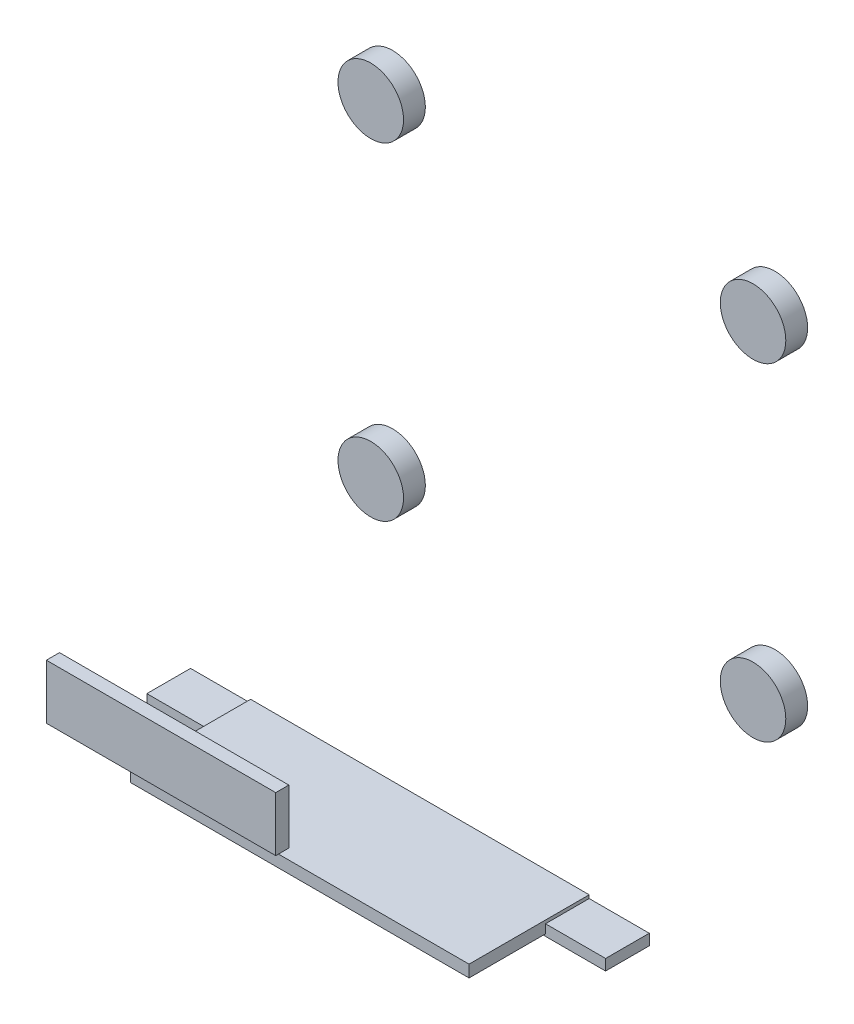
ISO-10303-21;
HEADER;
FILE_DESCRIPTION(('STEP AP214'),'2;1');
FILE_NAME('part.step','',(''),(''),'','','');
FILE_SCHEMA(('AUTOMOTIVE_DESIGN { 1 0 10303 214 1 1 1 1 }'));
ENDSEC;
DATA;
#1=APPLICATION_CONTEXT('core data for automotive mechanical design processes');
#2=APPLICATION_PROTOCOL_DEFINITION('international standard','automotive_design',2000,#1);
#3=PRODUCT_CONTEXT('',#1,'mechanical');
#4=PRODUCT('Part','Part','',(#3));
#5=PRODUCT_RELATED_PRODUCT_CATEGORY('part','',(#4));
#6=PRODUCT_DEFINITION_FORMATION('','',#4);
#7=PRODUCT_DEFINITION_CONTEXT('part definition',#1,'design');
#8=PRODUCT_DEFINITION('design','',#6,#7);
#9=PRODUCT_DEFINITION_SHAPE('','',#8);
#10=(LENGTH_UNIT() NAMED_UNIT(*) SI_UNIT(.MILLI.,.METRE.));
#11=(NAMED_UNIT(*) PLANE_ANGLE_UNIT() SI_UNIT($,.RADIAN.));
#12=(NAMED_UNIT(*) SI_UNIT($,.STERADIAN.) SOLID_ANGLE_UNIT());
#13=UNCERTAINTY_MEASURE_WITH_UNIT(LENGTH_MEASURE(1.E-05),#10,'distance_accuracy_value','');
#14=(GEOMETRIC_REPRESENTATION_CONTEXT(3) GLOBAL_UNCERTAINTY_ASSIGNED_CONTEXT((#13)) GLOBAL_UNIT_ASSIGNED_CONTEXT((#10,
#11,#12)) REPRESENTATION_CONTEXT('',''));
#15=CARTESIAN_POINT('',(0.,0.,0.));
#16=DIRECTION('',(0.,0.,1.));
#17=DIRECTION('',(1.,0.,0.));
#18=AXIS2_PLACEMENT_3D('',#15,#16,#17);
#19=CARTESIAN_POINT('',(35.,30.,0.));
#20=DIRECTION('',(0.,0.,-1.));
#21=DIRECTION('',(-1.,0.,0.));
#22=AXIS2_PLACEMENT_3D('',#19,#20,#21);
#23=CYLINDRICAL_SURFACE('',#22,6.);
#24=CARTESIAN_POINT('',(35.,30.,0.));
#25=DIRECTION('',(0.,0.,1.));
#26=DIRECTION('',(1.,0.,0.));
#27=AXIS2_PLACEMENT_3D('',#24,#25,#26);
#28=CIRCLE('',#27,6.);
#29=CARTESIAN_POINT('',(41.,30.,0.));
#30=VERTEX_POINT('',#29);
#31=EDGE_CURVE('E11',#30,#30,#28,.T.);
#32=ORIENTED_EDGE('',*,*,#31,.F.);
#33=EDGE_LOOP('',(#32));
#34=FACE_BOUND('',#33,.T.);
#35=CARTESIAN_POINT('',(35.,30.,-4.));
#36=DIRECTION('',(0.,0.,1.));
#37=DIRECTION('',(1.,0.,0.));
#38=AXIS2_PLACEMENT_3D('',#35,#36,#37);
#39=CIRCLE('',#38,6.);
#40=CARTESIAN_POINT('',(41.,30.,-4.));
#41=VERTEX_POINT('',#40);
#42=EDGE_CURVE('E45',#41,#41,#39,.T.);
#43=ORIENTED_EDGE('',*,*,#42,.T.);
#44=EDGE_LOOP('',(#43));
#45=FACE_BOUND('',#44,.T.);
#46=ADVANCED_FACE('F42',(#34,#45),#23,.T.);
#47=CARTESIAN_POINT('',(35.,30.,0.));
#48=DIRECTION('',(0.,0.,1.));
#49=DIRECTION('',(1.,0.,0.));
#50=AXIS2_PLACEMENT_3D('',#47,#48,#49);
#51=PLANE('',#50);
#52=ORIENTED_EDGE('',*,*,#31,.T.);
#53=EDGE_LOOP('',(#52));
#54=FACE_BOUND('',#53,.T.);
#55=ADVANCED_FACE('F57',(#54),#51,.T.);
#56=CARTESIAN_POINT('',(35.,30.,-4.));
#57=DIRECTION('',(0.,0.,1.));
#58=DIRECTION('',(1.,0.,0.));
#59=AXIS2_PLACEMENT_3D('',#56,#57,#58);
#60=PLANE('',#59);
#61=ORIENTED_EDGE('',*,*,#42,.F.);
#62=EDGE_LOOP('',(#61));
#63=FACE_BOUND('',#62,.T.);
#64=ADVANCED_FACE('F55',(#63),#60,.F.);
#65=CLOSED_SHELL('',(#46,#55,#64));
#66=MANIFOLD_SOLID_BREP('B2',#65);
#67=CARTESIAN_POINT('',(-35.,30.,0.));
#68=DIRECTION('',(0.,0.,-1.));
#69=DIRECTION('',(-1.,0.,0.));
#70=AXIS2_PLACEMENT_3D('',#67,#68,#69);
#71=CYLINDRICAL_SURFACE('',#70,6.);
#72=CARTESIAN_POINT('',(-35.,30.,0.));
#73=DIRECTION('',(0.,0.,1.));
#74=DIRECTION('',(1.,0.,0.));
#75=AXIS2_PLACEMENT_3D('',#72,#73,#74);
#76=CIRCLE('',#75,6.);
#77=CARTESIAN_POINT('',(-29.,30.,0.));
#78=VERTEX_POINT('',#77);
#79=EDGE_CURVE('E41',#78,#78,#76,.T.);
#80=ORIENTED_EDGE('',*,*,#79,.F.);
#81=EDGE_LOOP('',(#80));
#82=FACE_BOUND('',#81,.T.);
#83=CARTESIAN_POINT('',(-35.,30.,-4.));
#84=DIRECTION('',(0.,0.,1.));
#85=DIRECTION('',(1.,0.,0.));
#86=AXIS2_PLACEMENT_3D('',#83,#84,#85);
#87=CIRCLE('',#86,6.);
#88=CARTESIAN_POINT('',(-29.,30.,-4.));
#89=VERTEX_POINT('',#88);
#90=EDGE_CURVE('E94',#89,#89,#87,.T.);
#91=ORIENTED_EDGE('',*,*,#90,.T.);
#92=EDGE_LOOP('',(#91));
#93=FACE_BOUND('',#92,.T.);
#94=ADVANCED_FACE('F91',(#82,#93),#71,.T.);
#95=CARTESIAN_POINT('',(-35.,30.,0.));
#96=DIRECTION('',(0.,0.,1.));
#97=DIRECTION('',(1.,0.,0.));
#98=AXIS2_PLACEMENT_3D('',#95,#96,#97);
#99=PLANE('',#98);
#100=ORIENTED_EDGE('',*,*,#79,.T.);
#101=EDGE_LOOP('',(#100));
#102=FACE_BOUND('',#101,.T.);
#103=ADVANCED_FACE('F106',(#102),#99,.T.);
#104=CARTESIAN_POINT('',(-35.,30.,-4.));
#105=DIRECTION('',(0.,0.,1.));
#106=DIRECTION('',(1.,0.,0.));
#107=AXIS2_PLACEMENT_3D('',#104,#105,#106);
#108=PLANE('',#107);
#109=ORIENTED_EDGE('',*,*,#90,.F.);
#110=EDGE_LOOP('',(#109));
#111=FACE_BOUND('',#110,.T.);
#112=ADVANCED_FACE('F104',(#111),#108,.F.);
#113=CLOSED_SHELL('',(#94,#103,#112));
#114=MANIFOLD_SOLID_BREP('B6',#113);
#115=CARTESIAN_POINT('',(35.,-30.,0.));
#116=DIRECTION('',(0.,0.,-1.));
#117=DIRECTION('',(-1.,0.,0.));
#118=AXIS2_PLACEMENT_3D('',#115,#116,#117);
#119=CYLINDRICAL_SURFACE('',#118,6.);
#120=CARTESIAN_POINT('',(35.,-30.,0.));
#121=DIRECTION('',(0.,0.,1.));
#122=DIRECTION('',(1.,0.,0.));
#123=AXIS2_PLACEMENT_3D('',#120,#121,#122);
#124=CIRCLE('',#123,6.);
#125=CARTESIAN_POINT('',(41.,-30.,0.));
#126=VERTEX_POINT('',#125);
#127=EDGE_CURVE('E90',#126,#126,#124,.T.);
#128=ORIENTED_EDGE('',*,*,#127,.F.);
#129=EDGE_LOOP('',(#128));
#130=FACE_BOUND('',#129,.T.);
#131=CARTESIAN_POINT('',(35.,-30.,-4.));
#132=DIRECTION('',(0.,0.,1.));
#133=DIRECTION('',(1.,0.,0.));
#134=AXIS2_PLACEMENT_3D('',#131,#132,#133);
#135=CIRCLE('',#134,6.);
#136=CARTESIAN_POINT('',(41.,-30.,-4.));
#137=VERTEX_POINT('',#136);
#138=EDGE_CURVE('E143',#137,#137,#135,.T.);
#139=ORIENTED_EDGE('',*,*,#138,.T.);
#140=EDGE_LOOP('',(#139));
#141=FACE_BOUND('',#140,.T.);
#142=ADVANCED_FACE('F140',(#130,#141),#119,.T.);
#143=CARTESIAN_POINT('',(35.,-30.,0.));
#144=DIRECTION('',(0.,0.,1.));
#145=DIRECTION('',(1.,0.,0.));
#146=AXIS2_PLACEMENT_3D('',#143,#144,#145);
#147=PLANE('',#146);
#148=ORIENTED_EDGE('',*,*,#127,.T.);
#149=EDGE_LOOP('',(#148));
#150=FACE_BOUND('',#149,.T.);
#151=ADVANCED_FACE('F155',(#150),#147,.T.);
#152=CARTESIAN_POINT('',(35.,-30.,-4.));
#153=DIRECTION('',(0.,0.,1.));
#154=DIRECTION('',(1.,0.,0.));
#155=AXIS2_PLACEMENT_3D('',#152,#153,#154);
#156=PLANE('',#155);
#157=ORIENTED_EDGE('',*,*,#138,.F.);
#158=EDGE_LOOP('',(#157));
#159=FACE_BOUND('',#158,.T.);
#160=ADVANCED_FACE('F153',(#159),#156,.F.);
#161=CLOSED_SHELL('',(#142,#151,#160));
#162=MANIFOLD_SOLID_BREP('B36',#161);
#163=CARTESIAN_POINT('',(-35.,-30.,0.));
#164=DIRECTION('',(0.,0.,-1.));
#165=DIRECTION('',(-1.,0.,0.));
#166=AXIS2_PLACEMENT_3D('',#163,#164,#165);
#167=CYLINDRICAL_SURFACE('',#166,6.);
#168=CARTESIAN_POINT('',(-35.,-30.,0.));
#169=DIRECTION('',(0.,0.,1.));
#170=DIRECTION('',(1.,0.,0.));
#171=AXIS2_PLACEMENT_3D('',#168,#169,#170);
#172=CIRCLE('',#171,6.);
#173=CARTESIAN_POINT('',(-29.,-30.,0.));
#174=VERTEX_POINT('',#173);
#175=EDGE_CURVE('E139',#174,#174,#172,.T.);
#176=ORIENTED_EDGE('',*,*,#175,.F.);
#177=EDGE_LOOP('',(#176));
#178=FACE_BOUND('',#177,.T.);
#179=CARTESIAN_POINT('',(-35.,-30.,-4.));
#180=DIRECTION('',(0.,0.,1.));
#181=DIRECTION('',(1.,0.,0.));
#182=AXIS2_PLACEMENT_3D('',#179,#180,#181);
#183=CIRCLE('',#182,6.);
#184=CARTESIAN_POINT('',(-29.,-30.,-4.));
#185=VERTEX_POINT('',#184);
#186=EDGE_CURVE('E194',#185,#185,#183,.T.);
#187=ORIENTED_EDGE('',*,*,#186,.T.);
#188=EDGE_LOOP('',(#187));
#189=FACE_BOUND('',#188,.T.);
#190=ADVANCED_FACE('F191',(#178,#189),#167,.T.);
#191=CARTESIAN_POINT('',(-35.,-30.,0.));
#192=DIRECTION('',(0.,0.,1.));
#193=DIRECTION('',(1.,0.,0.));
#194=AXIS2_PLACEMENT_3D('',#191,#192,#193);
#195=PLANE('',#194);
#196=ORIENTED_EDGE('',*,*,#175,.T.);
#197=EDGE_LOOP('',(#196));
#198=FACE_BOUND('',#197,.T.);
#199=ADVANCED_FACE('F206',(#198),#195,.T.);
#200=CARTESIAN_POINT('',(-35.,-30.,-4.));
#201=DIRECTION('',(0.,0.,1.));
#202=DIRECTION('',(1.,0.,0.));
#203=AXIS2_PLACEMENT_3D('',#200,#201,#202);
#204=PLANE('',#203);
#205=ORIENTED_EDGE('',*,*,#186,.F.);
#206=EDGE_LOOP('',(#205));
#207=FACE_BOUND('',#206,.T.);
#208=ADVANCED_FACE('F204',(#207),#204,.F.);
#209=CLOSED_SHELL('',(#190,#199,#208));
#210=MANIFOLD_SOLID_BREP('B85',#209);
#211=CARTESIAN_POINT('',(42.,-52.5,34.));
#212=DIRECTION('',(-1.,0.,0.));
#213=DIRECTION('',(0.,0.,1.));
#214=AXIS2_PLACEMENT_3D('',#211,#212,#213);
#215=PLANE('',#214);
#216=DIRECTION('',(0.,1.,0.));
#217=VECTOR('',#216,1.);
#218=CARTESIAN_POINT('',(42.,-52.5,26.));
#219=LINE('',#218,#217);
#220=CARTESIAN_POINT('',(42.,-52.5,26.));
#221=VERTEX_POINT('',#220);
#222=CARTESIAN_POINT('',(42.,-50.5,26.));
#223=VERTEX_POINT('',#222);
#224=EDGE_CURVE('E305',#221,#223,#219,.T.);
#225=ORIENTED_EDGE('',*,*,#224,.T.);
#226=DIRECTION('',(0.,0.,-1.));
#227=VECTOR('',#226,1.);
#228=CARTESIAN_POINT('',(42.,-50.5,34.));
#229=LINE('',#228,#227);
#230=CARTESIAN_POINT('',(42.,-50.5,34.));
#231=VERTEX_POINT('',#230);
#232=EDGE_CURVE('E189',#231,#223,#229,.T.);
#233=ORIENTED_EDGE('',*,*,#232,.F.);
#234=DIRECTION('',(0.,1.,0.));
#235=VECTOR('',#234,1.);
#236=CARTESIAN_POINT('',(42.,-52.5,34.));
#237=LINE('',#236,#235);
#238=CARTESIAN_POINT('',(42.,-52.5,34.));
#239=VERTEX_POINT('',#238);
#240=EDGE_CURVE('E293',#239,#231,#237,.T.);
#241=ORIENTED_EDGE('',*,*,#240,.F.);
#242=DIRECTION('',(0.,0.,-1.));
#243=VECTOR('',#242,1.);
#244=CARTESIAN_POINT('',(42.,-52.5,34.));
#245=LINE('',#244,#243);
#246=EDGE_CURVE('E301',#239,#221,#245,.T.);
#247=ORIENTED_EDGE('',*,*,#246,.T.);
#248=EDGE_LOOP('',(#225,#233,#241,#247));
#249=FACE_BOUND('',#248,.T.);
#250=ADVANCED_FACE('F242',(#249),#215,.F.);
#251=CARTESIAN_POINT('',(30.,-50.5,34.));
#252=DIRECTION('',(0.,-1.,0.));
#253=DIRECTION('',(0.,0.,-1.));
#254=AXIS2_PLACEMENT_3D('',#251,#252,#253);
#255=PLANE('',#254);
#256=DIRECTION('',(-1.,0.,0.));
#257=VECTOR('',#256,1.);
#258=CARTESIAN_POINT('',(30.,-50.5,26.));
#259=LINE('',#258,#257);
#260=CARTESIAN_POINT('',(30.,-50.5,26.));
#261=VERTEX_POINT('',#260);
#262=EDGE_CURVE('E297',#223,#261,#259,.T.);
#263=ORIENTED_EDGE('',*,*,#262,.T.);
#264=DIRECTION('',(0.,0.,-1.));
#265=VECTOR('',#264,1.);
#266=CARTESIAN_POINT('',(30.,-50.5,34.));
#267=LINE('',#266,#265);
#268=CARTESIAN_POINT('',(30.,-50.5,34.));
#269=VERTEX_POINT('',#268);
#270=EDGE_CURVE('E250',#269,#261,#267,.T.);
#271=ORIENTED_EDGE('',*,*,#270,.F.);
#272=DIRECTION('',(-1.,0.,0.));
#273=VECTOR('',#272,1.);
#274=CARTESIAN_POINT('',(30.,-50.5,34.));
#275=LINE('',#274,#273);
#276=EDGE_CURVE('E288',#231,#269,#275,.T.);
#277=ORIENTED_EDGE('',*,*,#276,.F.);
#278=ORIENTED_EDGE('',*,*,#232,.T.);
#279=EDGE_LOOP('',(#263,#271,#277,#278));
#280=FACE_BOUND('',#279,.T.);
#281=ADVANCED_FACE('F296',(#280),#255,.F.);
#282=CARTESIAN_POINT('',(30.,-52.5,34.));
#283=DIRECTION('',(1.,0.,0.));
#284=DIRECTION('',(0.,0.,-1.));
#285=AXIS2_PLACEMENT_3D('',#282,#283,#284);
#286=PLANE('',#285);
#287=DIRECTION('',(0.,-1.,0.));
#288=VECTOR('',#287,1.);
#289=CARTESIAN_POINT('',(30.,-52.5,26.));
#290=LINE('',#289,#288);
#291=CARTESIAN_POINT('',(30.,-52.5,26.));
#292=VERTEX_POINT('',#291);
#293=EDGE_CURVE('E275',#261,#292,#290,.T.);
#294=ORIENTED_EDGE('',*,*,#293,.T.);
#295=DIRECTION('',(0.,0.,-1.));
#296=VECTOR('',#295,1.);
#297=CARTESIAN_POINT('',(30.,-52.5,34.));
#298=LINE('',#297,#296);
#299=CARTESIAN_POINT('',(30.,-52.5,34.));
#300=VERTEX_POINT('',#299);
#301=EDGE_CURVE('E298',#300,#292,#298,.T.);
#302=ORIENTED_EDGE('',*,*,#301,.F.);
#303=DIRECTION('',(0.,-1.,0.));
#304=VECTOR('',#303,1.);
#305=CARTESIAN_POINT('',(30.,-52.5,34.));
#306=LINE('',#305,#304);
#307=EDGE_CURVE('E291',#269,#300,#306,.T.);
#308=ORIENTED_EDGE('',*,*,#307,.F.);
#309=ORIENTED_EDGE('',*,*,#270,.T.);
#310=EDGE_LOOP('',(#294,#302,#308,#309));
#311=FACE_BOUND('',#310,.T.);
#312=ADVANCED_FACE('F299',(#311),#286,.F.);
#313=CARTESIAN_POINT('',(30.,-52.5,34.));
#314=DIRECTION('',(0.,1.,0.));
#315=DIRECTION('',(0.,0.,1.));
#316=AXIS2_PLACEMENT_3D('',#313,#314,#315);
#317=PLANE('',#316);
#318=DIRECTION('',(1.,0.,0.));
#319=VECTOR('',#318,1.);
#320=CARTESIAN_POINT('',(30.,-52.5,26.));
#321=LINE('',#320,#319);
#322=EDGE_CURVE('E281',#292,#221,#321,.T.);
#323=ORIENTED_EDGE('',*,*,#322,.T.);
#324=ORIENTED_EDGE('',*,*,#246,.F.);
#325=DIRECTION('',(1.,0.,0.));
#326=VECTOR('',#325,1.);
#327=CARTESIAN_POINT('',(30.,-52.5,34.));
#328=LINE('',#327,#326);
#329=EDGE_CURVE('E258',#300,#239,#328,.T.);
#330=ORIENTED_EDGE('',*,*,#329,.F.);
#331=ORIENTED_EDGE('',*,*,#301,.T.);
#332=EDGE_LOOP('',(#323,#324,#330,#331));
#333=FACE_BOUND('',#332,.T.);
#334=ADVANCED_FACE('F312',(#333),#317,.F.);
#335=CARTESIAN_POINT('',(0.,0.,34.));
#336=DIRECTION('',(0.,0.,-1.));
#337=DIRECTION('',(-1.,0.,0.));
#338=AXIS2_PLACEMENT_3D('',#335,#336,#337);
#339=PLANE('',#338);
#340=ORIENTED_EDGE('',*,*,#240,.T.);
#341=ORIENTED_EDGE('',*,*,#276,.T.);
#342=ORIENTED_EDGE('',*,*,#307,.T.);
#343=ORIENTED_EDGE('',*,*,#329,.T.);
#344=EDGE_LOOP('',(#340,#341,#342,#343));
#345=FACE_BOUND('',#344,.T.);
#346=ADVANCED_FACE('F289',(#345),#339,.F.);
#347=CARTESIAN_POINT('',(0.,0.,26.));
#348=DIRECTION('',(0.,0.,-1.));
#349=DIRECTION('',(-1.,0.,0.));
#350=AXIS2_PLACEMENT_3D('',#347,#348,#349);
#351=PLANE('',#350);
#352=ORIENTED_EDGE('',*,*,#224,.F.);
#353=ORIENTED_EDGE('',*,*,#322,.F.);
#354=ORIENTED_EDGE('',*,*,#293,.F.);
#355=ORIENTED_EDGE('',*,*,#262,.F.);
#356=EDGE_LOOP('',(#352,#353,#354,#355));
#357=FACE_BOUND('',#356,.T.);
#358=ADVANCED_FACE('F315',(#357),#351,.T.);
#359=CLOSED_SHELL('',(#250,#281,#312,#334,#346,#358));
#360=MANIFOLD_SOLID_BREP('B134',#359);
#361=CARTESIAN_POINT('',(-30.,-52.5,34.));
#362=DIRECTION('',(-1.,0.,0.));
#363=DIRECTION('',(0.,0.,1.));
#364=AXIS2_PLACEMENT_3D('',#361,#362,#363);
#365=PLANE('',#364);
#366=DIRECTION('',(0.,1.,0.));
#367=VECTOR('',#366,1.);
#368=CARTESIAN_POINT('',(-30.,-52.5,26.));
#369=LINE('',#368,#367);
#370=CARTESIAN_POINT('',(-30.,-52.5,26.));
#371=VERTEX_POINT('',#370);
#372=CARTESIAN_POINT('',(-30.,-50.5,26.));
#373=VERTEX_POINT('',#372);
#374=EDGE_CURVE('E439',#371,#373,#369,.T.);
#375=ORIENTED_EDGE('',*,*,#374,.T.);
#376=DIRECTION('',(0.,0.,-1.));
#377=VECTOR('',#376,1.);
#378=CARTESIAN_POINT('',(-30.,-50.5,34.));
#379=LINE('',#378,#377);
#380=CARTESIAN_POINT('',(-30.,-50.5,34.));
#381=VERTEX_POINT('',#380);
#382=EDGE_CURVE('E240',#381,#373,#379,.T.);
#383=ORIENTED_EDGE('',*,*,#382,.F.);
#384=DIRECTION('',(0.,1.,0.));
#385=VECTOR('',#384,1.);
#386=CARTESIAN_POINT('',(-30.,-52.5,34.));
#387=LINE('',#386,#385);
#388=CARTESIAN_POINT('',(-30.,-52.5,34.));
#389=VERTEX_POINT('',#388);
#390=EDGE_CURVE('E427',#389,#381,#387,.T.);
#391=ORIENTED_EDGE('',*,*,#390,.F.);
#392=DIRECTION('',(0.,0.,-1.));
#393=VECTOR('',#392,1.);
#394=CARTESIAN_POINT('',(-30.,-52.5,34.));
#395=LINE('',#394,#393);
#396=EDGE_CURVE('E435',#389,#371,#395,.T.);
#397=ORIENTED_EDGE('',*,*,#396,.T.);
#398=EDGE_LOOP('',(#375,#383,#391,#397));
#399=FACE_BOUND('',#398,.T.);
#400=ADVANCED_FACE('F376',(#399),#365,.F.);
#401=CARTESIAN_POINT('',(-42.,-50.5,34.));
#402=DIRECTION('',(0.,-1.,0.));
#403=DIRECTION('',(0.,0.,-1.));
#404=AXIS2_PLACEMENT_3D('',#401,#402,#403);
#405=PLANE('',#404);
#406=DIRECTION('',(-1.,0.,0.));
#407=VECTOR('',#406,1.);
#408=CARTESIAN_POINT('',(-42.,-50.5,26.));
#409=LINE('',#408,#407);
#410=CARTESIAN_POINT('',(-42.,-50.5,26.));
#411=VERTEX_POINT('',#410);
#412=EDGE_CURVE('E431',#373,#411,#409,.T.);
#413=ORIENTED_EDGE('',*,*,#412,.T.);
#414=DIRECTION('',(0.,0.,-1.));
#415=VECTOR('',#414,1.);
#416=CARTESIAN_POINT('',(-42.,-50.5,34.));
#417=LINE('',#416,#415);
#418=CARTESIAN_POINT('',(-42.,-50.5,34.));
#419=VERTEX_POINT('',#418);
#420=EDGE_CURVE('E384',#419,#411,#417,.T.);
#421=ORIENTED_EDGE('',*,*,#420,.F.);
#422=DIRECTION('',(-1.,0.,0.));
#423=VECTOR('',#422,1.);
#424=CARTESIAN_POINT('',(-42.,-50.5,34.));
#425=LINE('',#424,#423);
#426=EDGE_CURVE('E422',#381,#419,#425,.T.);
#427=ORIENTED_EDGE('',*,*,#426,.F.);
#428=ORIENTED_EDGE('',*,*,#382,.T.);
#429=EDGE_LOOP('',(#413,#421,#427,#428));
#430=FACE_BOUND('',#429,.T.);
#431=ADVANCED_FACE('F430',(#430),#405,.F.);
#432=CARTESIAN_POINT('',(-42.,-52.5,34.));
#433=DIRECTION('',(1.,0.,0.));
#434=DIRECTION('',(0.,0.,-1.));
#435=AXIS2_PLACEMENT_3D('',#432,#433,#434);
#436=PLANE('',#435);
#437=DIRECTION('',(0.,-1.,0.));
#438=VECTOR('',#437,1.);
#439=CARTESIAN_POINT('',(-42.,-52.5,26.));
#440=LINE('',#439,#438);
#441=CARTESIAN_POINT('',(-42.,-52.5,26.));
#442=VERTEX_POINT('',#441);
#443=EDGE_CURVE('E409',#411,#442,#440,.T.);
#444=ORIENTED_EDGE('',*,*,#443,.T.);
#445=DIRECTION('',(0.,0.,-1.));
#446=VECTOR('',#445,1.);
#447=CARTESIAN_POINT('',(-42.,-52.5,34.));
#448=LINE('',#447,#446);
#449=CARTESIAN_POINT('',(-42.,-52.5,34.));
#450=VERTEX_POINT('',#449);
#451=EDGE_CURVE('E432',#450,#442,#448,.T.);
#452=ORIENTED_EDGE('',*,*,#451,.F.);
#453=DIRECTION('',(0.,-1.,0.));
#454=VECTOR('',#453,1.);
#455=CARTESIAN_POINT('',(-42.,-52.5,34.));
#456=LINE('',#455,#454);
#457=EDGE_CURVE('E425',#419,#450,#456,.T.);
#458=ORIENTED_EDGE('',*,*,#457,.F.);
#459=ORIENTED_EDGE('',*,*,#420,.T.);
#460=EDGE_LOOP('',(#444,#452,#458,#459));
#461=FACE_BOUND('',#460,.T.);
#462=ADVANCED_FACE('F433',(#461),#436,.F.);
#463=CARTESIAN_POINT('',(-42.,-52.5,34.));
#464=DIRECTION('',(0.,1.,0.));
#465=DIRECTION('',(0.,0.,1.));
#466=AXIS2_PLACEMENT_3D('',#463,#464,#465);
#467=PLANE('',#466);
#468=DIRECTION('',(1.,0.,0.));
#469=VECTOR('',#468,1.);
#470=CARTESIAN_POINT('',(-42.,-52.5,26.));
#471=LINE('',#470,#469);
#472=EDGE_CURVE('E415',#442,#371,#471,.T.);
#473=ORIENTED_EDGE('',*,*,#472,.T.);
#474=ORIENTED_EDGE('',*,*,#396,.F.);
#475=DIRECTION('',(1.,0.,0.));
#476=VECTOR('',#475,1.);
#477=CARTESIAN_POINT('',(-42.,-52.5,34.));
#478=LINE('',#477,#476);
#479=EDGE_CURVE('E392',#450,#389,#478,.T.);
#480=ORIENTED_EDGE('',*,*,#479,.F.);
#481=ORIENTED_EDGE('',*,*,#451,.T.);
#482=EDGE_LOOP('',(#473,#474,#480,#481));
#483=FACE_BOUND('',#482,.T.);
#484=ADVANCED_FACE('F446',(#483),#467,.F.);
#485=CARTESIAN_POINT('',(0.,0.,34.));
#486=DIRECTION('',(0.,0.,-1.));
#487=DIRECTION('',(-1.,0.,0.));
#488=AXIS2_PLACEMENT_3D('',#485,#486,#487);
#489=PLANE('',#488);
#490=ORIENTED_EDGE('',*,*,#390,.T.);
#491=ORIENTED_EDGE('',*,*,#426,.T.);
#492=ORIENTED_EDGE('',*,*,#457,.T.);
#493=ORIENTED_EDGE('',*,*,#479,.T.);
#494=EDGE_LOOP('',(#490,#491,#492,#493));
#495=FACE_BOUND('',#494,.T.);
#496=ADVANCED_FACE('F423',(#495),#489,.F.);
#497=CARTESIAN_POINT('',(0.,0.,26.));
#498=DIRECTION('',(0.,0.,-1.));
#499=DIRECTION('',(-1.,0.,0.));
#500=AXIS2_PLACEMENT_3D('',#497,#498,#499);
#501=PLANE('',#500);
#502=ORIENTED_EDGE('',*,*,#374,.F.);
#503=ORIENTED_EDGE('',*,*,#472,.F.);
#504=ORIENTED_EDGE('',*,*,#443,.F.);
#505=ORIENTED_EDGE('',*,*,#412,.F.);
#506=EDGE_LOOP('',(#502,#503,#504,#505));
#507=FACE_BOUND('',#506,.T.);
#508=ADVANCED_FACE('F449',(#507),#501,.T.);
#509=CLOSED_SHELL('',(#400,#431,#462,#484,#496,#508));
#510=MANIFOLD_SOLID_BREP('B183',#509);
#511=CARTESIAN_POINT('',(21.,-25.,73.4));
#512=DIRECTION('',(-1.,0.,0.));
#513=DIRECTION('',(0.,0.,1.));
#514=AXIS2_PLACEMENT_3D('',#511,#512,#513);
#515=PLANE('',#514);
#516=DIRECTION('',(0.,1.,0.));
#517=VECTOR('',#516,1.);
#518=CARTESIAN_POINT('',(21.,-25.,71.));
#519=LINE('',#518,#517);
#520=CARTESIAN_POINT('',(21.,-25.,71.));
#521=VERTEX_POINT('',#520);
#522=CARTESIAN_POINT('',(21.,-15.,71.));
#523=VERTEX_POINT('',#522);
#524=EDGE_CURVE('E572',#521,#523,#519,.T.);
#525=ORIENTED_EDGE('',*,*,#524,.T.);
#526=DIRECTION('',(0.,0.,-1.));
#527=VECTOR('',#526,1.);
#528=CARTESIAN_POINT('',(21.,-15.,73.4));
#529=LINE('',#528,#527);
#530=CARTESIAN_POINT('',(21.,-15.,73.4));
#531=VERTEX_POINT('',#530);
#532=EDGE_CURVE('E374',#531,#523,#529,.T.);
#533=ORIENTED_EDGE('',*,*,#532,.F.);
#534=DIRECTION('',(0.,1.,0.));
#535=VECTOR('',#534,1.);
#536=CARTESIAN_POINT('',(21.,-25.,73.4));
#537=LINE('',#536,#535);
#538=CARTESIAN_POINT('',(21.,-25.,73.4));
#539=VERTEX_POINT('',#538);
#540=EDGE_CURVE('E560',#539,#531,#537,.T.);
#541=ORIENTED_EDGE('',*,*,#540,.F.);
#542=DIRECTION('',(0.,0.,-1.));
#543=VECTOR('',#542,1.);
#544=CARTESIAN_POINT('',(21.,-25.,73.4));
#545=LINE('',#544,#543);
#546=EDGE_CURVE('E568',#539,#521,#545,.T.);
#547=ORIENTED_EDGE('',*,*,#546,.T.);
#548=EDGE_LOOP('',(#525,#533,#541,#547));
#549=FACE_BOUND('',#548,.T.);
#550=ADVANCED_FACE('F509',(#549),#515,.F.);
#551=CARTESIAN_POINT('',(-21.,-15.,73.4));
#552=DIRECTION('',(0.,-1.,0.));
#553=DIRECTION('',(0.,0.,-1.));
#554=AXIS2_PLACEMENT_3D('',#551,#552,#553);
#555=PLANE('',#554);
#556=DIRECTION('',(-1.,0.,0.));
#557=VECTOR('',#556,1.);
#558=CARTESIAN_POINT('',(-21.,-15.,71.));
#559=LINE('',#558,#557);
#560=CARTESIAN_POINT('',(-21.,-15.,71.));
#561=VERTEX_POINT('',#560);
#562=EDGE_CURVE('E564',#523,#561,#559,.T.);
#563=ORIENTED_EDGE('',*,*,#562,.T.);
#564=DIRECTION('',(0.,0.,-1.));
#565=VECTOR('',#564,1.);
#566=CARTESIAN_POINT('',(-21.,-15.,73.4));
#567=LINE('',#566,#565);
#568=CARTESIAN_POINT('',(-21.,-15.,73.4));
#569=VERTEX_POINT('',#568);
#570=EDGE_CURVE('E517',#569,#561,#567,.T.);
#571=ORIENTED_EDGE('',*,*,#570,.F.);
#572=DIRECTION('',(-1.,0.,0.));
#573=VECTOR('',#572,1.);
#574=CARTESIAN_POINT('',(-21.,-15.,73.4));
#575=LINE('',#574,#573);
#576=EDGE_CURVE('E555',#531,#569,#575,.T.);
#577=ORIENTED_EDGE('',*,*,#576,.F.);
#578=ORIENTED_EDGE('',*,*,#532,.T.);
#579=EDGE_LOOP('',(#563,#571,#577,#578));
#580=FACE_BOUND('',#579,.T.);
#581=ADVANCED_FACE('F563',(#580),#555,.F.);
#582=CARTESIAN_POINT('',(-21.,-25.,73.4));
#583=DIRECTION('',(1.,0.,0.));
#584=DIRECTION('',(0.,0.,-1.));
#585=AXIS2_PLACEMENT_3D('',#582,#583,#584);
#586=PLANE('',#585);
#587=DIRECTION('',(0.,-1.,0.));
#588=VECTOR('',#587,1.);
#589=CARTESIAN_POINT('',(-21.,-25.,71.));
#590=LINE('',#589,#588);
#591=CARTESIAN_POINT('',(-21.,-25.,71.));
#592=VERTEX_POINT('',#591);
#593=EDGE_CURVE('E542',#561,#592,#590,.T.);
#594=ORIENTED_EDGE('',*,*,#593,.T.);
#595=DIRECTION('',(0.,0.,-1.));
#596=VECTOR('',#595,1.);
#597=CARTESIAN_POINT('',(-21.,-25.,73.4));
#598=LINE('',#597,#596);
#599=CARTESIAN_POINT('',(-21.,-25.,73.4));
#600=VERTEX_POINT('',#599);
#601=EDGE_CURVE('E565',#600,#592,#598,.T.);
#602=ORIENTED_EDGE('',*,*,#601,.F.);
#603=DIRECTION('',(0.,-1.,0.));
#604=VECTOR('',#603,1.);
#605=CARTESIAN_POINT('',(-21.,-25.,73.4));
#606=LINE('',#605,#604);
#607=EDGE_CURVE('E558',#569,#600,#606,.T.);
#608=ORIENTED_EDGE('',*,*,#607,.F.);
#609=ORIENTED_EDGE('',*,*,#570,.T.);
#610=EDGE_LOOP('',(#594,#602,#608,#609));
#611=FACE_BOUND('',#610,.T.);
#612=ADVANCED_FACE('F566',(#611),#586,.F.);
#613=CARTESIAN_POINT('',(-21.,-25.,73.4));
#614=DIRECTION('',(0.,1.,0.));
#615=DIRECTION('',(0.,0.,1.));
#616=AXIS2_PLACEMENT_3D('',#613,#614,#615);
#617=PLANE('',#616);
#618=DIRECTION('',(1.,0.,0.));
#619=VECTOR('',#618,1.);
#620=CARTESIAN_POINT('',(-21.,-25.,71.));
#621=LINE('',#620,#619);
#622=EDGE_CURVE('E548',#592,#521,#621,.T.);
#623=ORIENTED_EDGE('',*,*,#622,.T.);
#624=ORIENTED_EDGE('',*,*,#546,.F.);
#625=DIRECTION('',(1.,0.,0.));
#626=VECTOR('',#625,1.);
#627=CARTESIAN_POINT('',(-21.,-25.,73.4));
#628=LINE('',#627,#626);
#629=EDGE_CURVE('E525',#600,#539,#628,.T.);
#630=ORIENTED_EDGE('',*,*,#629,.F.);
#631=ORIENTED_EDGE('',*,*,#601,.T.);
#632=EDGE_LOOP('',(#623,#624,#630,#631));
#633=FACE_BOUND('',#632,.T.);
#634=ADVANCED_FACE('F579',(#633),#617,.F.);
#635=CARTESIAN_POINT('',(0.,0.,73.4));
#636=DIRECTION('',(0.,0.,-1.));
#637=DIRECTION('',(-1.,0.,0.));
#638=AXIS2_PLACEMENT_3D('',#635,#636,#637);
#639=PLANE('',#638);
#640=ORIENTED_EDGE('',*,*,#540,.T.);
#641=ORIENTED_EDGE('',*,*,#576,.T.);
#642=ORIENTED_EDGE('',*,*,#607,.T.);
#643=ORIENTED_EDGE('',*,*,#629,.T.);
#644=EDGE_LOOP('',(#640,#641,#642,#643));
#645=FACE_BOUND('',#644,.T.);
#646=ADVANCED_FACE('F556',(#645),#639,.F.);
#647=CARTESIAN_POINT('',(0.,0.,71.));
#648=DIRECTION('',(0.,0.,-1.));
#649=DIRECTION('',(-1.,0.,0.));
#650=AXIS2_PLACEMENT_3D('',#647,#648,#649);
#651=PLANE('',#650);
#652=ORIENTED_EDGE('',*,*,#524,.F.);
#653=ORIENTED_EDGE('',*,*,#622,.F.);
#654=ORIENTED_EDGE('',*,*,#593,.F.);
#655=ORIENTED_EDGE('',*,*,#562,.F.);
#656=EDGE_LOOP('',(#652,#653,#654,#655));
#657=FACE_BOUND('',#656,.T.);
#658=ADVANCED_FACE('F582',(#657),#651,.T.);
#659=CLOSED_SHELL('',(#550,#581,#612,#634,#646,#658));
#660=MANIFOLD_SOLID_BREP('B234',#659);
#661=CARTESIAN_POINT('',(31.,-52.1,48.));
#662=DIRECTION('',(-1.,0.,0.));
#663=DIRECTION('',(0.,0.,1.));
#664=AXIS2_PLACEMENT_3D('',#661,#662,#663);
#665=PLANE('',#664);
#666=DIRECTION('',(0.,1.,0.));
#667=VECTOR('',#666,1.);
#668=CARTESIAN_POINT('',(31.,-52.1,26.));
#669=LINE('',#668,#667);
#670=CARTESIAN_POINT('',(31.,-52.1,26.));
#671=VERTEX_POINT('',#670);
#672=CARTESIAN_POINT('',(31.,-49.9,26.));
#673=VERTEX_POINT('',#672);
#674=EDGE_CURVE('E696',#671,#673,#669,.T.);
#675=ORIENTED_EDGE('',*,*,#674,.T.);
#676=DIRECTION('',(0.,0.,-1.));
#677=VECTOR('',#676,1.);
#678=CARTESIAN_POINT('',(31.,-49.9,48.));
#679=LINE('',#678,#677);
#680=CARTESIAN_POINT('',(31.,-49.9,48.));
#681=VERTEX_POINT('',#680);
#682=EDGE_CURVE('E507',#681,#673,#679,.T.);
#683=ORIENTED_EDGE('',*,*,#682,.F.);
#684=DIRECTION('',(0.,1.,0.));
#685=VECTOR('',#684,1.);
#686=CARTESIAN_POINT('',(31.,-52.1,48.));
#687=LINE('',#686,#685);
#688=CARTESIAN_POINT('',(31.,-52.1,48.));
#689=VERTEX_POINT('',#688);
#690=EDGE_CURVE('E684',#689,#681,#687,.T.);
#691=ORIENTED_EDGE('',*,*,#690,.F.);
#692=DIRECTION('',(0.,0.,-1.));
#693=VECTOR('',#692,1.);
#694=CARTESIAN_POINT('',(31.,-52.1,48.));
#695=LINE('',#694,#693);
#696=EDGE_CURVE('E692',#689,#671,#695,.T.);
#697=ORIENTED_EDGE('',*,*,#696,.T.);
#698=EDGE_LOOP('',(#675,#683,#691,#697));
#699=FACE_BOUND('',#698,.T.);
#700=ADVANCED_FACE('F633',(#699),#665,.F.);
#701=CARTESIAN_POINT('',(-31.,-49.9,48.));
#702=DIRECTION('',(0.,-1.,0.));
#703=DIRECTION('',(0.,0.,-1.));
#704=AXIS2_PLACEMENT_3D('',#701,#702,#703);
#705=PLANE('',#704);
#706=DIRECTION('',(-1.,0.,0.));
#707=VECTOR('',#706,1.);
#708=CARTESIAN_POINT('',(-31.,-49.9,26.));
#709=LINE('',#708,#707);
#710=CARTESIAN_POINT('',(-31.,-49.9,26.));
#711=VERTEX_POINT('',#710);
#712=EDGE_CURVE('E688',#673,#711,#709,.T.);
#713=ORIENTED_EDGE('',*,*,#712,.T.);
#714=DIRECTION('',(0.,0.,-1.));
#715=VECTOR('',#714,1.);
#716=CARTESIAN_POINT('',(-31.,-49.9,48.));
#717=LINE('',#716,#715);
#718=CARTESIAN_POINT('',(-31.,-49.9,48.));
#719=VERTEX_POINT('',#718);
#720=EDGE_CURVE('E641',#719,#711,#717,.T.);
#721=ORIENTED_EDGE('',*,*,#720,.F.);
#722=DIRECTION('',(-1.,0.,0.));
#723=VECTOR('',#722,1.);
#724=CARTESIAN_POINT('',(-31.,-49.9,48.));
#725=LINE('',#724,#723);
#726=EDGE_CURVE('E679',#681,#719,#725,.T.);
#727=ORIENTED_EDGE('',*,*,#726,.F.);
#728=ORIENTED_EDGE('',*,*,#682,.T.);
#729=EDGE_LOOP('',(#713,#721,#727,#728));
#730=FACE_BOUND('',#729,.T.);
#731=ADVANCED_FACE('F687',(#730),#705,.F.);
#732=CARTESIAN_POINT('',(-31.,-52.1,48.));
#733=DIRECTION('',(1.,0.,0.));
#734=DIRECTION('',(0.,0.,-1.));
#735=AXIS2_PLACEMENT_3D('',#732,#733,#734);
#736=PLANE('',#735);
#737=DIRECTION('',(0.,-1.,0.));
#738=VECTOR('',#737,1.);
#739=CARTESIAN_POINT('',(-31.,-52.1,26.));
#740=LINE('',#739,#738);
#741=CARTESIAN_POINT('',(-31.,-52.1,26.));
#742=VERTEX_POINT('',#741);
#743=EDGE_CURVE('E666',#711,#742,#740,.T.);
#744=ORIENTED_EDGE('',*,*,#743,.T.);
#745=DIRECTION('',(0.,0.,-1.));
#746=VECTOR('',#745,1.);
#747=CARTESIAN_POINT('',(-31.,-52.1,48.));
#748=LINE('',#747,#746);
#749=CARTESIAN_POINT('',(-31.,-52.1,48.));
#750=VERTEX_POINT('',#749);
#751=EDGE_CURVE('E689',#750,#742,#748,.T.);
#752=ORIENTED_EDGE('',*,*,#751,.F.);
#753=DIRECTION('',(0.,-1.,0.));
#754=VECTOR('',#753,1.);
#755=CARTESIAN_POINT('',(-31.,-52.1,48.));
#756=LINE('',#755,#754);
#757=EDGE_CURVE('E682',#719,#750,#756,.T.);
#758=ORIENTED_EDGE('',*,*,#757,.F.);
#759=ORIENTED_EDGE('',*,*,#720,.T.);
#760=EDGE_LOOP('',(#744,#752,#758,#759));
#761=FACE_BOUND('',#760,.T.);
#762=ADVANCED_FACE('F690',(#761),#736,.F.);
#763=CARTESIAN_POINT('',(-31.,-52.1,48.));
#764=DIRECTION('',(0.,1.,0.));
#765=DIRECTION('',(0.,0.,1.));
#766=AXIS2_PLACEMENT_3D('',#763,#764,#765);
#767=PLANE('',#766);
#768=DIRECTION('',(1.,0.,0.));
#769=VECTOR('',#768,1.);
#770=CARTESIAN_POINT('',(-31.,-52.1,26.));
#771=LINE('',#770,#769);
#772=EDGE_CURVE('E672',#742,#671,#771,.T.);
#773=ORIENTED_EDGE('',*,*,#772,.T.);
#774=ORIENTED_EDGE('',*,*,#696,.F.);
#775=DIRECTION('',(1.,0.,0.));
#776=VECTOR('',#775,1.);
#777=CARTESIAN_POINT('',(-31.,-52.1,48.));
#778=LINE('',#777,#776);
#779=EDGE_CURVE('E649',#750,#689,#778,.T.);
#780=ORIENTED_EDGE('',*,*,#779,.F.);
#781=ORIENTED_EDGE('',*,*,#751,.T.);
#782=EDGE_LOOP('',(#773,#774,#780,#781));
#783=FACE_BOUND('',#782,.T.);
#784=ADVANCED_FACE('F703',(#783),#767,.F.);
#785=CARTESIAN_POINT('',(0.,0.,48.));
#786=DIRECTION('',(0.,0.,-1.));
#787=DIRECTION('',(-1.,0.,0.));
#788=AXIS2_PLACEMENT_3D('',#785,#786,#787);
#789=PLANE('',#788);
#790=ORIENTED_EDGE('',*,*,#690,.T.);
#791=ORIENTED_EDGE('',*,*,#726,.T.);
#792=ORIENTED_EDGE('',*,*,#757,.T.);
#793=ORIENTED_EDGE('',*,*,#779,.T.);
#794=EDGE_LOOP('',(#790,#791,#792,#793));
#795=FACE_BOUND('',#794,.T.);
#796=ADVANCED_FACE('F680',(#795),#789,.F.);
#797=CARTESIAN_POINT('',(0.,0.,26.));
#798=DIRECTION('',(0.,0.,-1.));
#799=DIRECTION('',(-1.,0.,0.));
#800=AXIS2_PLACEMENT_3D('',#797,#798,#799);
#801=PLANE('',#800);
#802=ORIENTED_EDGE('',*,*,#674,.F.);
#803=ORIENTED_EDGE('',*,*,#772,.F.);
#804=ORIENTED_EDGE('',*,*,#743,.F.);
#805=ORIENTED_EDGE('',*,*,#712,.F.);
#806=EDGE_LOOP('',(#802,#803,#804,#805));
#807=FACE_BOUND('',#806,.T.);
#808=ADVANCED_FACE('F706',(#807),#801,.T.);
#809=CLOSED_SHELL('',(#700,#731,#762,#784,#796,#808));
#810=MANIFOLD_SOLID_BREP('B368',#809);
#811=ADVANCED_BREP_SHAPE_REPRESENTATION('',(#18,#66,#114,#162,#210,#360,#510,#660,#810),#14);
#812=SHAPE_DEFINITION_REPRESENTATION(#9,#811);
ENDSEC;
END-ISO-10303-21;
